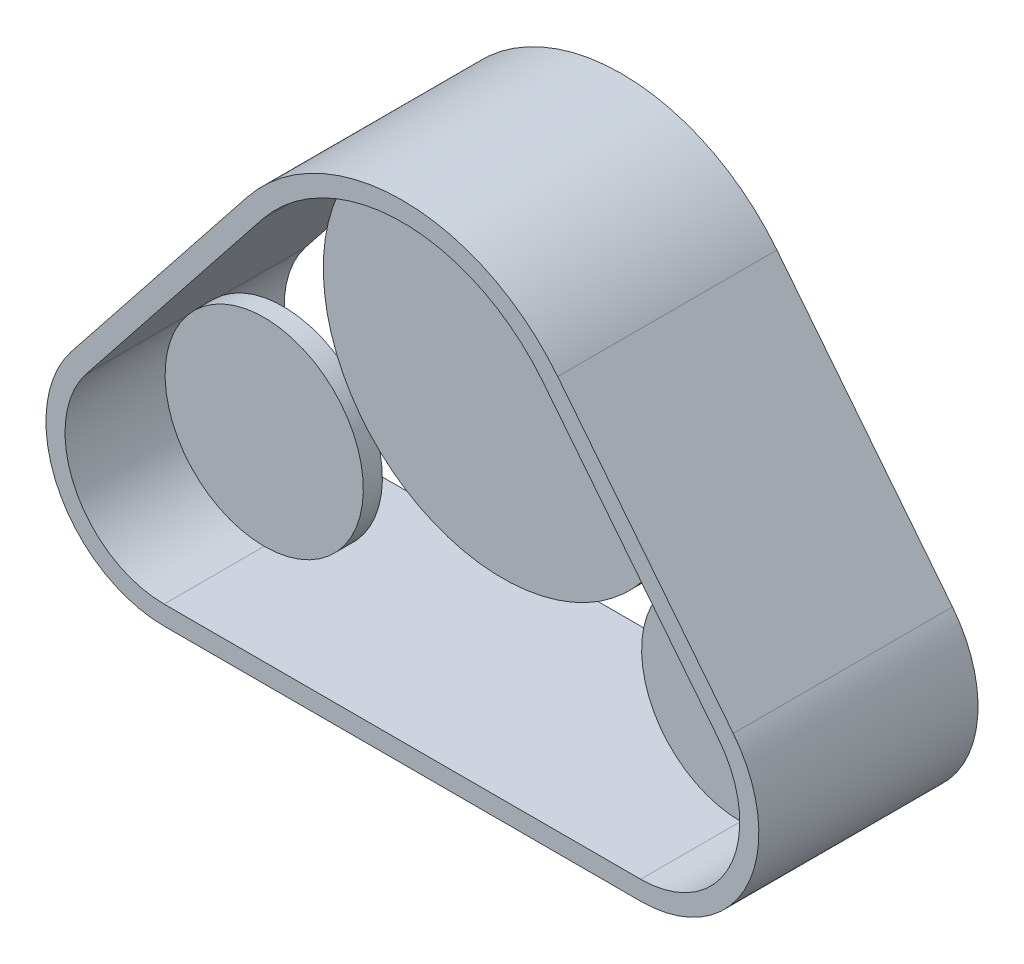
ISO-10303-21;
HEADER;
FILE_DESCRIPTION(('STEP AP214'),'2;1');
FILE_NAME('part.step','',(''),(''),'','','');
FILE_SCHEMA(('AUTOMOTIVE_DESIGN { 1 0 10303 214 1 1 1 1 }'));
ENDSEC;
DATA;
#1=APPLICATION_CONTEXT('core data for automotive mechanical design processes');
#2=APPLICATION_PROTOCOL_DEFINITION('international standard','automotive_design',2000,#1);
#3=PRODUCT_CONTEXT('',#1,'mechanical');
#4=PRODUCT('Part','Part','',(#3));
#5=PRODUCT_RELATED_PRODUCT_CATEGORY('part','',(#4));
#6=PRODUCT_DEFINITION_FORMATION('','',#4);
#7=PRODUCT_DEFINITION_CONTEXT('part definition',#1,'design');
#8=PRODUCT_DEFINITION('design','',#6,#7);
#9=PRODUCT_DEFINITION_SHAPE('','',#8);
#10=(LENGTH_UNIT() NAMED_UNIT(*) SI_UNIT(.MILLI.,.METRE.));
#11=(NAMED_UNIT(*) PLANE_ANGLE_UNIT() SI_UNIT($,.RADIAN.));
#12=(NAMED_UNIT(*) SI_UNIT($,.STERADIAN.) SOLID_ANGLE_UNIT());
#13=UNCERTAINTY_MEASURE_WITH_UNIT(LENGTH_MEASURE(1.E-05),#10,'distance_accuracy_value','');
#14=(GEOMETRIC_REPRESENTATION_CONTEXT(3) GLOBAL_UNCERTAINTY_ASSIGNED_CONTEXT((#13)) GLOBAL_UNIT_ASSIGNED_CONTEXT((#10,
#11,#12)) REPRESENTATION_CONTEXT('',''));
#15=CARTESIAN_POINT('',(0.,0.,0.));
#16=DIRECTION('',(0.,0.,1.));
#17=DIRECTION('',(1.,0.,0.));
#18=AXIS2_PLACEMENT_3D('',#15,#16,#17);
#19=CARTESIAN_POINT('',(0.,90.,-52.5));
#20=DIRECTION('',(0.,0.,1.));
#21=DIRECTION('',(1.,0.,0.));
#22=AXIS2_PLACEMENT_3D('',#19,#20,#21);
#23=CYLINDRICAL_SURFACE('',#22,94.);
#24=CARTESIAN_POINT('',(0.,90.,0.));
#25=DIRECTION('',(0.,0.,1.));
#26=DIRECTION('',(1.,0.,0.));
#27=AXIS2_PLACEMENT_3D('',#24,#25,#26);
#28=CIRCLE('',#27,94.);
#29=CARTESIAN_POINT('',(73.644175475114,148.416910382103,0.));
#30=VERTEX_POINT('',#29);
#31=CARTESIAN_POINT('',(-73.644175475114,148.416910382103,0.));
#32=VERTEX_POINT('',#31);
#33=EDGE_CURVE('E133',#30,#32,#28,.T.);
#34=ORIENTED_EDGE('',*,*,#33,.T.);
#35=DIRECTION('',(0.,0.,1.));
#36=VECTOR('',#35,1.);
#37=CARTESIAN_POINT('',(-73.644175475114,148.416910382103,-52.5));
#38=LINE('',#37,#36);
#39=CARTESIAN_POINT('',(-73.644175475114,148.416910382103,-52.5));
#40=VERTEX_POINT('',#39);
#41=EDGE_CURVE('E344',#40,#32,#38,.T.);
#42=ORIENTED_EDGE('',*,*,#41,.F.);
#43=CARTESIAN_POINT('',(0.,90.,-52.5));
#44=DIRECTION('',(0.,0.,1.));
#45=DIRECTION('',(1.,0.,0.));
#46=AXIS2_PLACEMENT_3D('',#43,#44,#45);
#47=CIRCLE('',#46,94.);
#48=CARTESIAN_POINT('',(73.644175475114,148.416910382103,-52.5));
#49=VERTEX_POINT('',#48);
#50=EDGE_CURVE('E316',#49,#40,#47,.T.);
#51=ORIENTED_EDGE('',*,*,#50,.F.);
#52=DIRECTION('',(0.,0.,1.));
#53=VECTOR('',#52,1.);
#54=CARTESIAN_POINT('',(73.644175475114,148.416910382103,-52.5));
#55=LINE('',#54,#53);
#56=EDGE_CURVE('E247',#49,#30,#55,.T.);
#57=ORIENTED_EDGE('',*,*,#56,.T.);
#58=EDGE_LOOP('',(#34,#42,#51,#57));
#59=FACE_BOUND('',#58,.T.);
#60=ADVANCED_FACE('F109',(#59),#23,.F.);
#61=CARTESIAN_POINT('',(125.,0.,-52.5));
#62=DIRECTION('',(0.,0.,1.));
#63=DIRECTION('',(1.,0.,0.));
#64=AXIS2_PLACEMENT_3D('',#61,#62,#63);
#65=CYLINDRICAL_SURFACE('',#64,52.);
#66=CARTESIAN_POINT('',(125.,0.,0.));
#67=DIRECTION('',(0.,0.,1.));
#68=DIRECTION('',(1.,0.,0.));
#69=AXIS2_PLACEMENT_3D('',#66,#67,#68);
#70=CIRCLE('',#69,52.);
#71=CARTESIAN_POINT('',(125.,-52.,0.));
#72=VERTEX_POINT('',#71);
#73=CARTESIAN_POINT('',(165.739331113893,32.3157376581846,0.));
#74=VERTEX_POINT('',#73);
#75=EDGE_CURVE('E272',#72,#74,#70,.T.);
#76=ORIENTED_EDGE('',*,*,#75,.T.);
#77=DIRECTION('',(0.,0.,1.));
#78=VECTOR('',#77,1.);
#79=CARTESIAN_POINT('',(165.739331113893,32.3157376581846,-52.5));
#80=LINE('',#79,#78);
#81=CARTESIAN_POINT('',(165.739331113893,32.3157376581846,-52.5));
#82=VERTEX_POINT('',#81);
#83=EDGE_CURVE('E245',#82,#74,#80,.T.);
#84=ORIENTED_EDGE('',*,*,#83,.F.);
#85=CARTESIAN_POINT('',(125.,0.,-52.5));
#86=DIRECTION('',(0.,0.,1.));
#87=DIRECTION('',(1.,0.,0.));
#88=AXIS2_PLACEMENT_3D('',#85,#86,#87);
#89=CIRCLE('',#88,52.);
#90=CARTESIAN_POINT('',(125.,-52.,-52.5));
#91=VERTEX_POINT('',#90);
#92=EDGE_CURVE('E310',#91,#82,#89,.T.);
#93=ORIENTED_EDGE('',*,*,#92,.F.);
#94=DIRECTION('',(0.,0.,1.));
#95=VECTOR('',#94,1.);
#96=CARTESIAN_POINT('',(125.,-52.,-52.5));
#97=LINE('',#96,#95);
#98=EDGE_CURVE('E329',#91,#72,#97,.T.);
#99=ORIENTED_EDGE('',*,*,#98,.T.);
#100=EDGE_LOOP('',(#76,#84,#93,#99));
#101=FACE_BOUND('',#100,.T.);
#102=ADVANCED_FACE('F415',(#101),#65,.F.);
#103=CARTESIAN_POINT('',(-125.,0.,10.));
#104=DIRECTION('',(0.,0.,-1.));
#105=DIRECTION('',(-1.,0.,0.));
#106=AXIS2_PLACEMENT_3D('',#103,#104,#105);
#107=CYLINDRICAL_SURFACE('',#106,52.);
#108=CARTESIAN_POINT('',(-125.,0.,10.));
#109=DIRECTION('',(0.,0.,1.));
#110=DIRECTION('',(1.,0.,0.));
#111=AXIS2_PLACEMENT_3D('',#108,#109,#110);
#112=CIRCLE('',#111,52.);
#113=CARTESIAN_POINT('',(-125.,-52.,10.));
#114=VERTEX_POINT('',#113);
#115=CARTESIAN_POINT('',(-165.739331113893,32.3157376581845,10.));
#116=VERTEX_POINT('',#115);
#117=EDGE_CURVE('E118',#114,#116,#112,.T.);
#118=ORIENTED_EDGE('',*,*,#117,.F.);
#119=DIRECTION('',(0.,0.,1.));
#120=VECTOR('',#119,1.);
#121=CARTESIAN_POINT('',(-125.,-52.,-52.5));
#122=LINE('',#121,#120);
#123=CARTESIAN_POINT('',(-125.,-52.,0.));
#124=VERTEX_POINT('',#123);
#125=EDGE_CURVE('E337',#124,#114,#122,.T.);
#126=ORIENTED_EDGE('',*,*,#125,.F.);
#127=CARTESIAN_POINT('',(-125.,0.,0.));
#128=DIRECTION('',(0.,0.,1.));
#129=DIRECTION('',(1.,0.,0.));
#130=AXIS2_PLACEMENT_3D('',#127,#128,#129);
#131=CIRCLE('',#130,52.);
#132=CARTESIAN_POINT('',(-165.739331113893,32.3157376581845,0.));
#133=VERTEX_POINT('',#132);
#134=EDGE_CURVE('E368',#124,#133,#131,.T.);
#135=ORIENTED_EDGE('',*,*,#134,.T.);
#136=DIRECTION('',(0.,0.,1.));
#137=VECTOR('',#136,1.);
#138=CARTESIAN_POINT('',(-165.739331113893,32.3157376581845,-52.5));
#139=LINE('',#138,#137);
#140=EDGE_CURVE('E342',#133,#116,#139,.T.);
#141=ORIENTED_EDGE('',*,*,#140,.T.);
#142=EDGE_LOOP('',(#118,#126,#135,#141));
#143=FACE_BOUND('',#142,.T.);
#144=ADVANCED_FACE('F111',(#143),#107,.T.);
#145=CARTESIAN_POINT('',(-125.,0.,10.));
#146=DIRECTION('',(0.,0.,1.));
#147=DIRECTION('',(1.,0.,0.));
#148=AXIS2_PLACEMENT_3D('',#145,#146,#147);
#149=PLANE('',#148);
#150=EDGE_CURVE('E12',#116,#114,#112,.T.);
#151=ORIENTED_EDGE('',*,*,#150,.T.);
#152=ORIENTED_EDGE('',*,*,#117,.T.);
#153=EDGE_LOOP('',(#151,#152));
#154=FACE_BOUND('',#153,.T.);
#155=ADVANCED_FACE('F633',(#154),#149,.T.);
#156=CARTESIAN_POINT('',(-125.,0.,0.));
#157=DIRECTION('',(0.,0.,1.));
#158=DIRECTION('',(1.,0.,0.));
#159=AXIS2_PLACEMENT_3D('',#156,#157,#158);
#160=PLANE('',#159);
#161=EDGE_CURVE('E113',#133,#124,#131,.T.);
#162=ORIENTED_EDGE('',*,*,#161,.F.);
#163=ORIENTED_EDGE('',*,*,#134,.F.);
#164=EDGE_LOOP('',(#162,#163));
#165=FACE_BOUND('',#164,.T.);
#166=ADVANCED_FACE('F501',(#165),#160,.F.);
#167=CARTESIAN_POINT('',(-125.,0.,-52.5));
#168=DIRECTION('',(0.,0.,1.));
#169=DIRECTION('',(1.,0.,0.));
#170=AXIS2_PLACEMENT_3D('',#167,#168,#169);
#171=CYLINDRICAL_SURFACE('',#170,52.);
#172=CARTESIAN_POINT('',(-165.739331113893,32.3157376581845,-52.5));
#173=VERTEX_POINT('',#172);
#174=EDGE_CURVE('E339',#173,#133,#139,.T.);
#175=ORIENTED_EDGE('',*,*,#174,.T.);
#176=ORIENTED_EDGE('',*,*,#161,.T.);
#177=CARTESIAN_POINT('',(-125.,-52.,-52.5));
#178=VERTEX_POINT('',#177);
#179=EDGE_CURVE('E334',#178,#124,#122,.T.);
#180=ORIENTED_EDGE('',*,*,#179,.F.);
#181=CARTESIAN_POINT('',(-125.,0.,-52.5));
#182=DIRECTION('',(0.,0.,1.));
#183=DIRECTION('',(1.,0.,0.));
#184=AXIS2_PLACEMENT_3D('',#181,#182,#183);
#185=CIRCLE('',#184,52.);
#186=EDGE_CURVE('E322',#173,#178,#185,.T.);
#187=ORIENTED_EDGE('',*,*,#186,.F.);
#188=EDGE_LOOP('',(#175,#176,#180,#187));
#189=FACE_BOUND('',#188,.T.);
#190=ADVANCED_FACE('F439',(#189),#171,.F.);
#191=CARTESIAN_POINT('',(125.,0.,-52.5));
#192=DIRECTION('',(0.,0.,1.));
#193=DIRECTION('',(1.,0.,0.));
#194=AXIS2_PLACEMENT_3D('',#191,#192,#193);
#195=CYLINDRICAL_SURFACE('',#194,62.);
#196=DIRECTION('',(0.,0.,1.));
#197=VECTOR('',#196,1.);
#198=CARTESIAN_POINT('',(173.573817866565,38.5303025924508,-52.5));
#199=LINE('',#198,#197);
#200=CARTESIAN_POINT('',(173.573817866565,38.5303025924508,-52.5));
#201=VERTEX_POINT('',#200);
#202=CARTESIAN_POINT('',(173.573817866565,38.5303025924508,62.5));
#203=VERTEX_POINT('',#202);
#204=EDGE_CURVE('E365',#201,#203,#199,.T.);
#205=ORIENTED_EDGE('',*,*,#204,.T.);
#206=CARTESIAN_POINT('',(125.,0.,62.5));
#207=DIRECTION('',(0.,0.,1.));
#208=DIRECTION('',(1.,0.,0.));
#209=AXIS2_PLACEMENT_3D('',#206,#207,#208);
#210=CIRCLE('',#209,62.);
#211=CARTESIAN_POINT('',(125.,-62.,62.5));
#212=VERTEX_POINT('',#211);
#213=EDGE_CURVE('E292',#212,#203,#210,.T.);
#214=ORIENTED_EDGE('',*,*,#213,.F.);
#215=DIRECTION('',(0.,0.,1.));
#216=VECTOR('',#215,1.);
#217=CARTESIAN_POINT('',(125.,-62.,-52.5));
#218=LINE('',#217,#216);
#219=CARTESIAN_POINT('',(125.,-62.,-52.5));
#220=VERTEX_POINT('',#219);
#221=EDGE_CURVE('E366',#220,#212,#218,.T.);
#222=ORIENTED_EDGE('',*,*,#221,.F.);
#223=CARTESIAN_POINT('',(125.,0.,-52.5));
#224=DIRECTION('',(0.,0.,1.));
#225=DIRECTION('',(1.,0.,0.));
#226=AXIS2_PLACEMENT_3D('',#223,#224,#225);
#227=CIRCLE('',#226,62.);
#228=EDGE_CURVE('E332',#220,#201,#227,.T.);
#229=ORIENTED_EDGE('',*,*,#228,.T.);
#230=EDGE_LOOP('',(#205,#214,#222,#229));
#231=FACE_BOUND('',#230,.T.);
#232=ADVANCED_FACE('F380',(#231),#195,.T.);
#233=CARTESIAN_POINT('',(125.,-62.,-52.5));
#234=DIRECTION('',(0.,-1.,0.));
#235=DIRECTION('',(1.,0.,0.));
#236=AXIS2_PLACEMENT_3D('',#233,#234,#235);
#237=PLANE('',#236);
#238=ORIENTED_EDGE('',*,*,#221,.T.);
#239=DIRECTION('',(1.,0.,0.));
#240=VECTOR('',#239,1.);
#241=CARTESIAN_POINT('',(125.,-62.,62.5));
#242=LINE('',#241,#240);
#243=CARTESIAN_POINT('',(-125.,-62.,62.5));
#244=VERTEX_POINT('',#243);
#245=EDGE_CURVE('E307',#244,#212,#242,.T.);
#246=ORIENTED_EDGE('',*,*,#245,.F.);
#247=DIRECTION('',(0.,0.,1.));
#248=VECTOR('',#247,1.);
#249=CARTESIAN_POINT('',(-125.,-62.,-52.5));
#250=LINE('',#249,#248);
#251=CARTESIAN_POINT('',(-125.,-62.,-52.5));
#252=VERTEX_POINT('',#251);
#253=EDGE_CURVE('E369',#252,#244,#250,.T.);
#254=ORIENTED_EDGE('',*,*,#253,.F.);
#255=DIRECTION('',(1.,0.,0.));
#256=VECTOR('',#255,1.);
#257=CARTESIAN_POINT('',(125.,-62.,-52.5));
#258=LINE('',#257,#256);
#259=EDGE_CURVE('E362',#252,#220,#258,.T.);
#260=ORIENTED_EDGE('',*,*,#259,.T.);
#261=EDGE_LOOP('',(#238,#246,#254,#260));
#262=FACE_BOUND('',#261,.T.);
#263=ADVANCED_FACE('F392',(#262),#237,.T.);
#264=CARTESIAN_POINT('',(-125.,0.,-52.5));
#265=DIRECTION('',(0.,0.,1.));
#266=DIRECTION('',(1.,0.,0.));
#267=AXIS2_PLACEMENT_3D('',#264,#265,#266);
#268=CYLINDRICAL_SURFACE('',#267,62.);
#269=ORIENTED_EDGE('',*,*,#253,.T.);
#270=CARTESIAN_POINT('',(-125.,0.,62.5));
#271=DIRECTION('',(0.,0.,1.));
#272=DIRECTION('',(1.,0.,0.));
#273=AXIS2_PLACEMENT_3D('',#270,#271,#272);
#274=CIRCLE('',#273,62.);
#275=CARTESIAN_POINT('',(-173.573817866565,38.5303025924508,62.5));
#276=VERTEX_POINT('',#275);
#277=EDGE_CURVE('E304',#276,#244,#274,.T.);
#278=ORIENTED_EDGE('',*,*,#277,.F.);
#279=DIRECTION('',(0.,0.,1.));
#280=VECTOR('',#279,1.);
#281=CARTESIAN_POINT('',(-173.573817866565,38.5303025924508,-52.5));
#282=LINE('',#281,#280);
#283=CARTESIAN_POINT('',(-173.573817866565,38.5303025924508,-52.5));
#284=VERTEX_POINT('',#283);
#285=EDGE_CURVE('E371',#284,#276,#282,.T.);
#286=ORIENTED_EDGE('',*,*,#285,.F.);
#287=CARTESIAN_POINT('',(-125.,0.,-52.5));
#288=DIRECTION('',(0.,0.,1.));
#289=DIRECTION('',(1.,0.,0.));
#290=AXIS2_PLACEMENT_3D('',#287,#288,#289);
#291=CIRCLE('',#290,62.);
#292=EDGE_CURVE('E359',#284,#252,#291,.T.);
#293=ORIENTED_EDGE('',*,*,#292,.T.);
#294=EDGE_LOOP('',(#269,#278,#286,#293));
#295=FACE_BOUND('',#294,.T.);
#296=ADVANCED_FACE('F405',(#295),#268,.T.);
#297=CARTESIAN_POINT('',(-173.573817866565,38.5303025924508,-52.5));
#298=DIRECTION('',(-0.78344867526717,0.621456493426625,0.));
#299=DIRECTION('',(-0.621456493426625,-0.78344867526717,0.));
#300=AXIS2_PLACEMENT_3D('',#297,#298,#299);
#301=PLANE('',#300);
#302=ORIENTED_EDGE('',*,*,#285,.T.);
#303=DIRECTION('',(-0.621456493426625,-0.78344867526717,0.));
#304=VECTOR('',#303,1.);
#305=CARTESIAN_POINT('',(-173.573817866565,38.5303025924508,62.5));
#306=LINE('',#305,#304);
#307=CARTESIAN_POINT('',(-81.4786622277856,154.631475316369,62.5));
#308=VERTEX_POINT('',#307);
#309=EDGE_CURVE('E301',#308,#276,#306,.T.);
#310=ORIENTED_EDGE('',*,*,#309,.F.);
#311=DIRECTION('',(0.,0.,1.));
#312=VECTOR('',#311,1.);
#313=CARTESIAN_POINT('',(-81.4786622277856,154.631475316369,-52.5));
#314=LINE('',#313,#312);
#315=CARTESIAN_POINT('',(-81.4786622277856,154.631475316369,-52.5));
#316=VERTEX_POINT('',#315);
#317=EDGE_CURVE('E373',#316,#308,#314,.T.);
#318=ORIENTED_EDGE('',*,*,#317,.F.);
#319=DIRECTION('',(-0.621456493426625,-0.78344867526717,0.));
#320=VECTOR('',#319,1.);
#321=CARTESIAN_POINT('',(-173.573817866565,38.5303025924508,-52.5));
#322=LINE('',#321,#320);
#323=EDGE_CURVE('E356',#316,#284,#322,.T.);
#324=ORIENTED_EDGE('',*,*,#323,.T.);
#325=EDGE_LOOP('',(#302,#310,#318,#324));
#326=FACE_BOUND('',#325,.T.);
#327=ADVANCED_FACE('F403',(#326),#301,.T.);
#328=CARTESIAN_POINT('',(0.,90.,-52.5));
#329=DIRECTION('',(0.,0.,1.));
#330=DIRECTION('',(1.,0.,0.));
#331=AXIS2_PLACEMENT_3D('',#328,#329,#330);
#332=CYLINDRICAL_SURFACE('',#331,104.);
#333=ORIENTED_EDGE('',*,*,#317,.T.);
#334=CARTESIAN_POINT('',(0.,90.,62.5));
#335=DIRECTION('',(0.,0.,1.));
#336=DIRECTION('',(1.,0.,0.));
#337=AXIS2_PLACEMENT_3D('',#334,#335,#336);
#338=CIRCLE('',#337,104.);
#339=CARTESIAN_POINT('',(81.4786622277857,154.631475316369,62.5));
#340=VERTEX_POINT('',#339);
#341=EDGE_CURVE('E298',#340,#308,#338,.T.);
#342=ORIENTED_EDGE('',*,*,#341,.F.);
#343=DIRECTION('',(0.,0.,1.));
#344=VECTOR('',#343,1.);
#345=CARTESIAN_POINT('',(81.4786622277857,154.631475316369,-52.5));
#346=LINE('',#345,#344);
#347=CARTESIAN_POINT('',(81.4786622277857,154.631475316369,-52.5));
#348=VERTEX_POINT('',#347);
#349=EDGE_CURVE('E375',#348,#340,#346,.T.);
#350=ORIENTED_EDGE('',*,*,#349,.F.);
#351=CARTESIAN_POINT('',(0.,90.,-52.5));
#352=DIRECTION('',(0.,0.,1.));
#353=DIRECTION('',(1.,0.,0.));
#354=AXIS2_PLACEMENT_3D('',#351,#352,#353);
#355=CIRCLE('',#354,104.);
#356=EDGE_CURVE('E353',#348,#316,#355,.T.);
#357=ORIENTED_EDGE('',*,*,#356,.T.);
#358=EDGE_LOOP('',(#333,#342,#350,#357));
#359=FACE_BOUND('',#358,.T.);
#360=ADVANCED_FACE('F400',(#359),#332,.T.);
#361=CARTESIAN_POINT('',(81.4786622277857,154.631475316369,-52.5));
#362=DIRECTION('',(0.78344867526717,0.621456493426625,0.));
#363=DIRECTION('',(-0.621456493426625,0.78344867526717,0.));
#364=AXIS2_PLACEMENT_3D('',#361,#362,#363);
#365=PLANE('',#364);
#366=ORIENTED_EDGE('',*,*,#349,.T.);
#367=DIRECTION('',(-0.621456493426625,0.78344867526717,0.));
#368=VECTOR('',#367,1.);
#369=CARTESIAN_POINT('',(81.4786622277857,154.631475316369,62.5));
#370=LINE('',#369,#368);
#371=EDGE_CURVE('E295',#203,#340,#370,.T.);
#372=ORIENTED_EDGE('',*,*,#371,.F.);
#373=ORIENTED_EDGE('',*,*,#204,.F.);
#374=DIRECTION('',(-0.621456493426625,0.78344867526717,0.));
#375=VECTOR('',#374,1.);
#376=CARTESIAN_POINT('',(81.4786622277857,154.631475316369,-52.5));
#377=LINE('',#376,#375);
#378=EDGE_CURVE('E350',#201,#348,#377,.T.);
#379=ORIENTED_EDGE('',*,*,#378,.T.);
#380=EDGE_LOOP('',(#366,#372,#373,#379));
#381=FACE_BOUND('',#380,.T.);
#382=ADVANCED_FACE('F384',(#381),#365,.T.);
#383=CARTESIAN_POINT('',(125.,0.,-52.5));
#384=DIRECTION('',(0.,0.,1.));
#385=DIRECTION('',(1.,0.,0.));
#386=AXIS2_PLACEMENT_3D('',#383,#384,#385);
#387=PLANE('',#386);
#388=DIRECTION('',(1.,0.,0.));
#389=VECTOR('',#388,1.);
#390=CARTESIAN_POINT('',(125.,-52.,-52.5));
#391=LINE('',#390,#389);
#392=EDGE_CURVE('E325',#178,#91,#391,.T.);
#393=ORIENTED_EDGE('',*,*,#392,.T.);
#394=ORIENTED_EDGE('',*,*,#92,.T.);
#395=DIRECTION('',(-0.621456493426625,0.78344867526717,0.));
#396=VECTOR('',#395,1.);
#397=CARTESIAN_POINT('',(73.644175475114,148.416910382103,-52.5));
#398=LINE('',#397,#396);
#399=EDGE_CURVE('E313',#82,#49,#398,.T.);
#400=ORIENTED_EDGE('',*,*,#399,.T.);
#401=ORIENTED_EDGE('',*,*,#50,.T.);
#402=DIRECTION('',(-0.621456493426625,-0.78344867526717,0.));
#403=VECTOR('',#402,1.);
#404=CARTESIAN_POINT('',(-165.739331113893,32.3157376581845,-52.5));
#405=LINE('',#404,#403);
#406=EDGE_CURVE('E319',#40,#173,#405,.T.);
#407=ORIENTED_EDGE('',*,*,#406,.T.);
#408=ORIENTED_EDGE('',*,*,#186,.T.);
#409=EDGE_LOOP('',(#393,#394,#400,#401,#407,#408));
#410=FACE_BOUND('',#409,.T.);
#411=ORIENTED_EDGE('',*,*,#228,.F.);
#412=ORIENTED_EDGE('',*,*,#259,.F.);
#413=ORIENTED_EDGE('',*,*,#292,.F.);
#414=ORIENTED_EDGE('',*,*,#323,.F.);
#415=ORIENTED_EDGE('',*,*,#356,.F.);
#416=ORIENTED_EDGE('',*,*,#378,.F.);
#417=EDGE_LOOP('',(#411,#412,#413,#414,#415,#416));
#418=FACE_BOUND('',#417,.T.);
#419=ADVANCED_FACE('F395',(#410,#418),#387,.F.);
#420=CARTESIAN_POINT('',(165.739331113893,32.3157376581846,10.));
#421=VERTEX_POINT('',#420);
#422=CARTESIAN_POINT('',(165.739331113893,32.3157376581846,62.5));
#423=VERTEX_POINT('',#422);
#424=EDGE_CURVE('E328',#421,#423,#80,.T.);
#425=ORIENTED_EDGE('',*,*,#424,.F.);
#426=CARTESIAN_POINT('',(125.,0.,10.));
#427=DIRECTION('',(0.,0.,1.));
#428=DIRECTION('',(1.,0.,0.));
#429=AXIS2_PLACEMENT_3D('',#426,#427,#428);
#430=CIRCLE('',#429,52.);
#431=CARTESIAN_POINT('',(125.,-52.,10.));
#432=VERTEX_POINT('',#431);
#433=EDGE_CURVE('E267',#432,#421,#430,.T.);
#434=ORIENTED_EDGE('',*,*,#433,.F.);
#435=CARTESIAN_POINT('',(125.,-52.,62.5));
#436=VERTEX_POINT('',#435);
#437=EDGE_CURVE('E333',#432,#436,#97,.T.);
#438=ORIENTED_EDGE('',*,*,#437,.T.);
#439=CARTESIAN_POINT('',(125.,0.,62.5));
#440=DIRECTION('',(0.,0.,1.));
#441=DIRECTION('',(1.,0.,0.));
#442=AXIS2_PLACEMENT_3D('',#439,#440,#441);
#443=CIRCLE('',#442,52.);
#444=EDGE_CURVE('E277',#436,#423,#443,.T.);
#445=ORIENTED_EDGE('',*,*,#444,.T.);
#446=EDGE_LOOP('',(#425,#434,#438,#445));
#447=FACE_BOUND('',#446,.T.);
#448=ADVANCED_FACE('F422',(#447),#65,.F.);
#449=CARTESIAN_POINT('',(125.,-52.,-52.5));
#450=DIRECTION('',(0.,-1.,0.));
#451=DIRECTION('',(1.,0.,0.));
#452=AXIS2_PLACEMENT_3D('',#449,#450,#451);
#453=PLANE('',#452);
#454=ORIENTED_EDGE('',*,*,#179,.T.);
#455=ORIENTED_EDGE('',*,*,#125,.T.);
#456=CARTESIAN_POINT('',(-125.,-52.,62.5));
#457=VERTEX_POINT('',#456);
#458=EDGE_CURVE('E338',#114,#457,#122,.T.);
#459=ORIENTED_EDGE('',*,*,#458,.T.);
#460=DIRECTION('',(1.,0.,0.));
#461=VECTOR('',#460,1.);
#462=CARTESIAN_POINT('',(125.,-52.,62.5));
#463=LINE('',#462,#461);
#464=EDGE_CURVE('E289',#457,#436,#463,.T.);
#465=ORIENTED_EDGE('',*,*,#464,.T.);
#466=ORIENTED_EDGE('',*,*,#437,.F.);
#467=DIRECTION('',(0.,0.,-1.));
#468=VECTOR('',#467,1.);
#469=CARTESIAN_POINT('',(125.,-52.,10.));
#470=LINE('',#469,#468);
#471=EDGE_CURVE('E271',#72,#432,#470,.F.);
#472=ORIENTED_EDGE('',*,*,#471,.F.);
#473=ORIENTED_EDGE('',*,*,#98,.F.);
#474=ORIENTED_EDGE('',*,*,#392,.F.);
#475=EDGE_LOOP('',(#454,#455,#459,#465,#466,#472,#473,#474));
#476=FACE_BOUND('',#475,.T.);
#477=ADVANCED_FACE('F436',(#476),#453,.F.);
#478=ORIENTED_EDGE('',*,*,#150,.F.);
#479=CARTESIAN_POINT('',(-165.739331113893,32.3157376581845,62.5));
#480=VERTEX_POINT('',#479);
#481=EDGE_CURVE('E343',#116,#480,#139,.T.);
#482=ORIENTED_EDGE('',*,*,#481,.T.);
#483=CARTESIAN_POINT('',(-125.,0.,62.5));
#484=DIRECTION('',(0.,0.,1.));
#485=DIRECTION('',(1.,0.,0.));
#486=AXIS2_PLACEMENT_3D('',#483,#484,#485);
#487=CIRCLE('',#486,52.);
#488=EDGE_CURVE('E286',#480,#457,#487,.T.);
#489=ORIENTED_EDGE('',*,*,#488,.T.);
#490=ORIENTED_EDGE('',*,*,#458,.F.);
#491=EDGE_LOOP('',(#478,#482,#489,#490));
#492=FACE_BOUND('',#491,.T.);
#493=ADVANCED_FACE('F431',(#492),#171,.F.);
#494=CARTESIAN_POINT('',(-165.739331113893,32.3157376581845,-52.5));
#495=DIRECTION('',(-0.78344867526717,0.621456493426625,0.));
#496=DIRECTION('',(-0.621456493426625,-0.78344867526717,0.));
#497=AXIS2_PLACEMENT_3D('',#494,#495,#496);
#498=PLANE('',#497);
#499=ORIENTED_EDGE('',*,*,#41,.T.);
#500=DIRECTION('',(0.,0.,-1.));
#501=VECTOR('',#500,1.);
#502=CARTESIAN_POINT('',(-73.6441754751139,148.416910382103,10.));
#503=LINE('',#502,#501);
#504=CARTESIAN_POINT('',(-73.644175475114,148.416910382103,10.));
#505=VERTEX_POINT('',#504);
#506=EDGE_CURVE('E265',#32,#505,#503,.F.);
#507=ORIENTED_EDGE('',*,*,#506,.T.);
#508=CARTESIAN_POINT('',(-73.644175475114,148.416910382103,62.5));
#509=VERTEX_POINT('',#508);
#510=EDGE_CURVE('E125',#505,#509,#38,.T.);
#511=ORIENTED_EDGE('',*,*,#510,.T.);
#512=DIRECTION('',(-0.621456493426625,-0.78344867526717,0.));
#513=VECTOR('',#512,1.);
#514=CARTESIAN_POINT('',(-165.739331113893,32.3157376581845,62.5));
#515=LINE('',#514,#513);
#516=EDGE_CURVE('E283',#509,#480,#515,.T.);
#517=ORIENTED_EDGE('',*,*,#516,.T.);
#518=ORIENTED_EDGE('',*,*,#481,.F.);
#519=ORIENTED_EDGE('',*,*,#140,.F.);
#520=ORIENTED_EDGE('',*,*,#174,.F.);
#521=ORIENTED_EDGE('',*,*,#406,.F.);
#522=EDGE_LOOP('',(#499,#507,#511,#517,#518,#519,#520,#521));
#523=FACE_BOUND('',#522,.T.);
#524=ADVANCED_FACE('F426',(#523),#498,.F.);
#525=ORIENTED_EDGE('',*,*,#510,.F.);
#526=CARTESIAN_POINT('',(0.,90.,10.));
#527=DIRECTION('',(0.,0.,1.));
#528=DIRECTION('',(1.,0.,0.));
#529=AXIS2_PLACEMENT_3D('',#526,#527,#528);
#530=CIRCLE('',#529,94.);
#531=CARTESIAN_POINT('',(73.644175475114,148.416910382103,10.));
#532=VERTEX_POINT('',#531);
#533=EDGE_CURVE('E249',#532,#505,#530,.T.);
#534=ORIENTED_EDGE('',*,*,#533,.F.);
#535=CARTESIAN_POINT('',(73.644175475114,148.416910382103,62.5));
#536=VERTEX_POINT('',#535);
#537=EDGE_CURVE('E236',#532,#536,#55,.T.);
#538=ORIENTED_EDGE('',*,*,#537,.T.);
#539=CARTESIAN_POINT('',(0.,90.,62.5));
#540=DIRECTION('',(0.,0.,1.));
#541=DIRECTION('',(1.,0.,0.));
#542=AXIS2_PLACEMENT_3D('',#539,#540,#541);
#543=CIRCLE('',#542,94.);
#544=EDGE_CURVE('E281',#536,#509,#543,.T.);
#545=ORIENTED_EDGE('',*,*,#544,.T.);
#546=EDGE_LOOP('',(#525,#534,#538,#545));
#547=FACE_BOUND('',#546,.T.);
#548=ADVANCED_FACE('F250',(#547),#23,.F.);
#549=CARTESIAN_POINT('',(73.644175475114,148.416910382103,-52.5));
#550=DIRECTION('',(0.78344867526717,0.621456493426625,0.));
#551=DIRECTION('',(-0.621456493426625,0.78344867526717,0.));
#552=AXIS2_PLACEMENT_3D('',#549,#550,#551);
#553=PLANE('',#552);
#554=ORIENTED_EDGE('',*,*,#83,.T.);
#555=EDGE_CURVE('E347',#74,#421,#80,.T.);
#556=ORIENTED_EDGE('',*,*,#555,.T.);
#557=ORIENTED_EDGE('',*,*,#424,.T.);
#558=DIRECTION('',(-0.621456493426625,0.78344867526717,0.));
#559=VECTOR('',#558,1.);
#560=CARTESIAN_POINT('',(73.644175475114,148.416910382103,62.5));
#561=LINE('',#560,#559);
#562=EDGE_CURVE('E243',#423,#536,#561,.T.);
#563=ORIENTED_EDGE('',*,*,#562,.T.);
#564=ORIENTED_EDGE('',*,*,#537,.F.);
#565=EDGE_CURVE('E241',#30,#532,#55,.T.);
#566=ORIENTED_EDGE('',*,*,#565,.F.);
#567=ORIENTED_EDGE('',*,*,#56,.F.);
#568=ORIENTED_EDGE('',*,*,#399,.F.);
#569=EDGE_LOOP('',(#554,#556,#557,#563,#564,#566,#567,#568));
#570=FACE_BOUND('',#569,.T.);
#571=ADVANCED_FACE('F238',(#570),#553,.F.);
#572=CARTESIAN_POINT('',(125.,0.,62.5));
#573=DIRECTION('',(0.,0.,1.));
#574=DIRECTION('',(1.,0.,0.));
#575=AXIS2_PLACEMENT_3D('',#572,#573,#574);
#576=PLANE('',#575);
#577=ORIENTED_EDGE('',*,*,#213,.T.);
#578=ORIENTED_EDGE('',*,*,#371,.T.);
#579=ORIENTED_EDGE('',*,*,#341,.T.);
#580=ORIENTED_EDGE('',*,*,#309,.T.);
#581=ORIENTED_EDGE('',*,*,#277,.T.);
#582=ORIENTED_EDGE('',*,*,#245,.T.);
#583=EDGE_LOOP('',(#577,#578,#579,#580,#581,#582));
#584=FACE_BOUND('',#583,.T.);
#585=ORIENTED_EDGE('',*,*,#562,.F.);
#586=ORIENTED_EDGE('',*,*,#444,.F.);
#587=ORIENTED_EDGE('',*,*,#464,.F.);
#588=ORIENTED_EDGE('',*,*,#488,.F.);
#589=ORIENTED_EDGE('',*,*,#516,.F.);
#590=ORIENTED_EDGE('',*,*,#544,.F.);
#591=EDGE_LOOP('',(#585,#586,#587,#588,#589,#590));
#592=FACE_BOUND('',#591,.T.);
#593=ADVANCED_FACE('F387',(#584,#592),#576,.T.);
#594=CARTESIAN_POINT('',(125.,0.,10.));
#595=DIRECTION('',(0.,0.,-1.));
#596=DIRECTION('',(-1.,0.,0.));
#597=AXIS2_PLACEMENT_3D('',#594,#595,#596);
#598=CYLINDRICAL_SURFACE('',#597,52.);
#599=EDGE_CURVE('E268',#74,#72,#70,.T.);
#600=ORIENTED_EDGE('',*,*,#599,.T.);
#601=ORIENTED_EDGE('',*,*,#471,.T.);
#602=EDGE_CURVE('E273',#421,#432,#430,.T.);
#603=ORIENTED_EDGE('',*,*,#602,.F.);
#604=ORIENTED_EDGE('',*,*,#555,.F.);
#605=EDGE_LOOP('',(#600,#601,#603,#604));
#606=FACE_BOUND('',#605,.T.);
#607=ADVANCED_FACE('F446',(#606),#598,.T.);
#608=CARTESIAN_POINT('',(125.,0.,10.));
#609=DIRECTION('',(0.,0.,1.));
#610=DIRECTION('',(1.,0.,0.));
#611=AXIS2_PLACEMENT_3D('',#608,#609,#610);
#612=PLANE('',#611);
#613=ORIENTED_EDGE('',*,*,#602,.T.);
#614=ORIENTED_EDGE('',*,*,#433,.T.);
#615=EDGE_LOOP('',(#613,#614));
#616=FACE_BOUND('',#615,.T.);
#617=ADVANCED_FACE('F447',(#616),#612,.T.);
#618=CARTESIAN_POINT('',(125.,0.,0.));
#619=DIRECTION('',(0.,0.,1.));
#620=DIRECTION('',(1.,0.,0.));
#621=AXIS2_PLACEMENT_3D('',#618,#619,#620);
#622=PLANE('',#621);
#623=ORIENTED_EDGE('',*,*,#599,.F.);
#624=ORIENTED_EDGE('',*,*,#75,.F.);
#625=EDGE_LOOP('',(#623,#624));
#626=FACE_BOUND('',#625,.T.);
#627=ADVANCED_FACE('F450',(#626),#622,.F.);
#628=CARTESIAN_POINT('',(0.,90.,10.));
#629=DIRECTION('',(0.,0.,-1.));
#630=DIRECTION('',(-1.,0.,0.));
#631=AXIS2_PLACEMENT_3D('',#628,#629,#630);
#632=CYLINDRICAL_SURFACE('',#631,94.);
#633=ORIENTED_EDGE('',*,*,#506,.F.);
#634=EDGE_CURVE('E253',#32,#30,#28,.T.);
#635=ORIENTED_EDGE('',*,*,#634,.T.);
#636=ORIENTED_EDGE('',*,*,#565,.T.);
#637=EDGE_CURVE('E254',#505,#532,#530,.T.);
#638=ORIENTED_EDGE('',*,*,#637,.F.);
#639=EDGE_LOOP('',(#633,#635,#636,#638));
#640=FACE_BOUND('',#639,.T.);
#641=ADVANCED_FACE('F260',(#640),#632,.T.);
#642=CARTESIAN_POINT('',(0.,90.,10.));
#643=DIRECTION('',(0.,0.,1.));
#644=DIRECTION('',(1.,0.,0.));
#645=AXIS2_PLACEMENT_3D('',#642,#643,#644);
#646=PLANE('',#645);
#647=ORIENTED_EDGE('',*,*,#533,.T.);
#648=ORIENTED_EDGE('',*,*,#637,.T.);
#649=EDGE_LOOP('',(#647,#648));
#650=FACE_BOUND('',#649,.T.);
#651=ADVANCED_FACE('F262',(#650),#646,.T.);
#652=CARTESIAN_POINT('',(0.,90.,0.));
#653=DIRECTION('',(0.,0.,1.));
#654=DIRECTION('',(1.,0.,0.));
#655=AXIS2_PLACEMENT_3D('',#652,#653,#654);
#656=PLANE('',#655);
#657=ORIENTED_EDGE('',*,*,#33,.F.);
#658=ORIENTED_EDGE('',*,*,#634,.F.);
#659=EDGE_LOOP('',(#657,#658));
#660=FACE_BOUND('',#659,.T.);
#661=ADVANCED_FACE('F460',(#660),#656,.F.);
#662=CLOSED_SHELL('',(#60,#102,#144,#155,#166,#190,#232,#263,#296,#327,#360,#382,#419,#448,#477,
#493,#524,#548,#571,#593,#607,#617,#627,#641,#651,#661));
#663=MANIFOLD_SOLID_BREP('B2',#662);
#664=ADVANCED_BREP_SHAPE_REPRESENTATION('',(#18,#663),#14);
#665=SHAPE_DEFINITION_REPRESENTATION(#9,#664);
ENDSEC;
END-ISO-10303-21;
